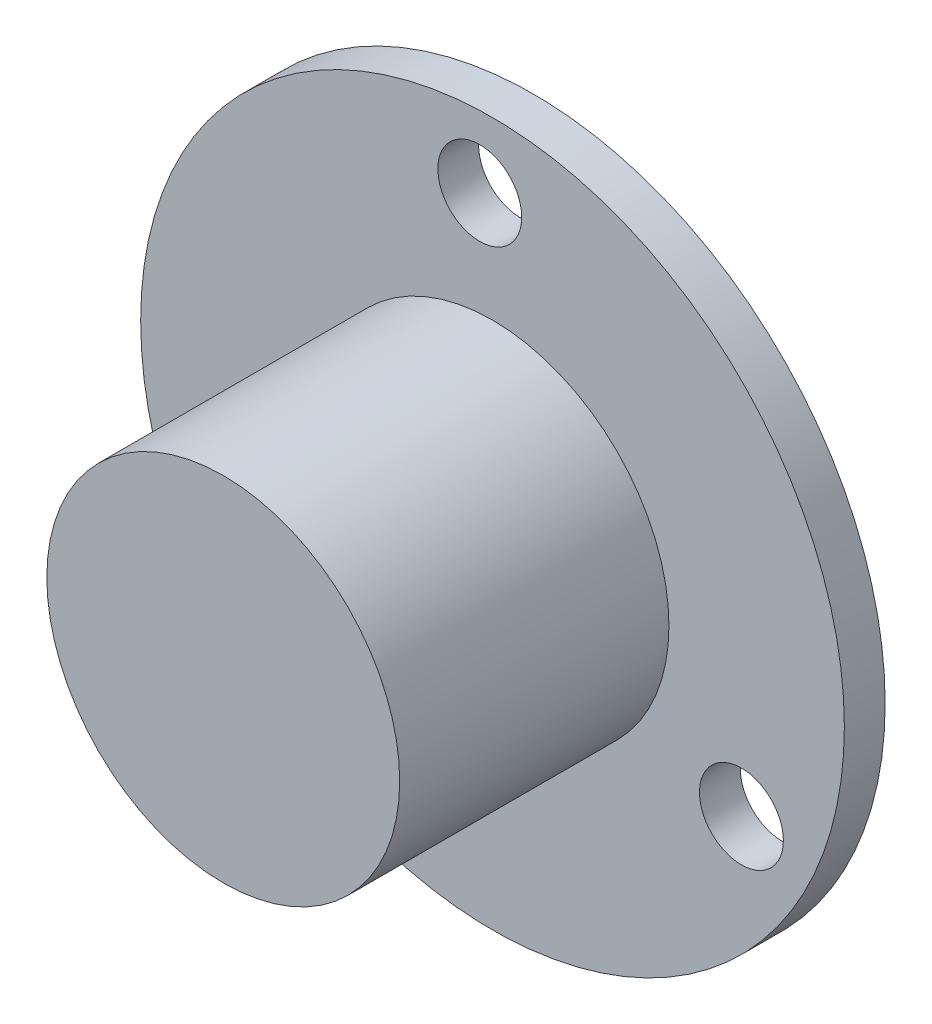
ISO-10303-21;
HEADER;
FILE_DESCRIPTION(('STEP AP214'),'2;1');
FILE_NAME('part.step','',(''),(''),'','','');
FILE_SCHEMA(('AUTOMOTIVE_DESIGN { 1 0 10303 214 1 1 1 1 }'));
ENDSEC;
DATA;
#1=APPLICATION_CONTEXT('core data for automotive mechanical design processes');
#2=APPLICATION_PROTOCOL_DEFINITION('international standard','automotive_design',2000,#1);
#3=PRODUCT_CONTEXT('',#1,'mechanical');
#4=PRODUCT('Part','Part','',(#3));
#5=PRODUCT_RELATED_PRODUCT_CATEGORY('part','',(#4));
#6=PRODUCT_DEFINITION_FORMATION('','',#4);
#7=PRODUCT_DEFINITION_CONTEXT('part definition',#1,'design');
#8=PRODUCT_DEFINITION('design','',#6,#7);
#9=PRODUCT_DEFINITION_SHAPE('','',#8);
#10=(LENGTH_UNIT() NAMED_UNIT(*) SI_UNIT(.MILLI.,.METRE.));
#11=(NAMED_UNIT(*) PLANE_ANGLE_UNIT() SI_UNIT($,.RADIAN.));
#12=(NAMED_UNIT(*) SI_UNIT($,.STERADIAN.) SOLID_ANGLE_UNIT());
#13=UNCERTAINTY_MEASURE_WITH_UNIT(LENGTH_MEASURE(1.E-05),#10,'distance_accuracy_value','');
#14=(GEOMETRIC_REPRESENTATION_CONTEXT(3) GLOBAL_UNCERTAINTY_ASSIGNED_CONTEXT((#13)) GLOBAL_UNIT_ASSIGNED_CONTEXT((#10,
#11,#12)) REPRESENTATION_CONTEXT('',''));
#15=CARTESIAN_POINT('',(0.,0.,0.));
#16=DIRECTION('',(0.,0.,1.));
#17=DIRECTION('',(1.,0.,0.));
#18=AXIS2_PLACEMENT_3D('',#15,#16,#17);
#19=CARTESIAN_POINT('',(0.,0.,2.54));
#20=DIRECTION('',(0.,0.,1.));
#21=DIRECTION('',(1.,0.,0.));
#22=AXIS2_PLACEMENT_3D('',#19,#20,#21);
#23=PLANE('',#22);
#24=CARTESIAN_POINT('',(-14.704072056255,-9.4060001204126,2.54));
#25=DIRECTION('',(0.,0.,1.));
#26=DIRECTION('',(1.,0.,0.));
#27=AXIS2_PLACEMENT_3D('',#24,#25,#26);
#28=CIRCLE('',#27,2.61066084405858);
#29=CARTESIAN_POINT('',(-12.0934112121964,-9.4060001204126,2.54));
#30=VERTEX_POINT('',#29);
#31=EDGE_CURVE('E60',#30,#30,#28,.T.);
#32=ORIENTED_EDGE('',*,*,#31,.F.);
#33=EDGE_LOOP('',(#32));
#34=FACE_BOUND('',#33,.T.);
#35=CARTESIAN_POINT('',(-0.793799024149222,17.4371,2.54));
#36=DIRECTION('',(0.,0.,1.));
#37=DIRECTION('',(1.,0.,0.));
#38=AXIS2_PLACEMENT_3D('',#35,#36,#37);
#39=CIRCLE('',#38,2.61066084405858);
#40=CARTESIAN_POINT('',(1.81686181990936,17.4371,2.54));
#41=VERTEX_POINT('',#40);
#42=EDGE_CURVE('E49',#41,#41,#39,.T.);
#43=ORIENTED_EDGE('',*,*,#42,.F.);
#44=EDGE_LOOP('',(#43));
#45=FACE_BOUND('',#44,.T.);
#46=CARTESIAN_POINT('',(0.,0.,2.54));
#47=DIRECTION('',(0.,0.,1.));
#48=DIRECTION('',(1.,0.,0.));
#49=AXIS2_PLACEMENT_3D('',#46,#47,#48);
#50=CIRCLE('',#49,21.9075);
#51=CARTESIAN_POINT('',(21.9075,0.,2.54));
#52=VERTEX_POINT('',#51);
#53=EDGE_CURVE('E40',#52,#52,#50,.T.);
#54=ORIENTED_EDGE('',*,*,#53,.T.);
#55=EDGE_LOOP('',(#54));
#56=FACE_BOUND('',#55,.T.);
#57=CARTESIAN_POINT('',(15.4978710804043,-8.03109987958733,2.54));
#58=DIRECTION('',(0.,0.,1.));
#59=DIRECTION('',(1.,0.,0.));
#60=AXIS2_PLACEMENT_3D('',#57,#58,#59);
#61=CIRCLE('',#60,2.61066084405858);
#62=CARTESIAN_POINT('',(18.1085319244629,-8.03109987958733,2.54));
#63=VERTEX_POINT('',#62);
#64=EDGE_CURVE('E54',#63,#63,#61,.T.);
#65=ORIENTED_EDGE('',*,*,#64,.F.);
#66=EDGE_LOOP('',(#65));
#67=FACE_BOUND('',#66,.T.);
#68=CARTESIAN_POINT('',(0.,0.,2.54));
#69=DIRECTION('',(0.,0.,1.));
#70=DIRECTION('',(1.,0.,0.));
#71=AXIS2_PLACEMENT_3D('',#68,#69,#70);
#72=CIRCLE('',#71,10.9855);
#73=CARTESIAN_POINT('',(10.9855,0.,2.54));
#74=VERTEX_POINT('',#73);
#75=EDGE_CURVE('E72',#74,#74,#72,.T.);
#76=ORIENTED_EDGE('',*,*,#75,.F.);
#77=EDGE_LOOP('',(#76));
#78=FACE_BOUND('',#77,.T.);
#79=ADVANCED_FACE('F33',(#34,#45,#56,#67,#78),#23,.T.);
#80=CARTESIAN_POINT('',(0.,0.,0.));
#81=DIRECTION('',(0.,0.,1.));
#82=DIRECTION('',(1.,0.,0.));
#83=AXIS2_PLACEMENT_3D('',#80,#81,#82);
#84=PLANE('',#83);
#85=CARTESIAN_POINT('',(-14.704072056255,-9.4060001204126,0.));
#86=DIRECTION('',(0.,0.,1.));
#87=DIRECTION('',(1.,0.,0.));
#88=AXIS2_PLACEMENT_3D('',#85,#86,#87);
#89=CIRCLE('',#88,2.61066084405858);
#90=CARTESIAN_POINT('',(-12.0934112121964,-9.4060001204126,0.));
#91=VERTEX_POINT('',#90);
#92=EDGE_CURVE('E63',#91,#91,#89,.T.);
#93=ORIENTED_EDGE('',*,*,#92,.T.);
#94=EDGE_LOOP('',(#93));
#95=FACE_BOUND('',#94,.T.);
#96=CARTESIAN_POINT('',(-0.793799024149222,17.4371,0.));
#97=DIRECTION('',(0.,0.,1.));
#98=DIRECTION('',(1.,0.,0.));
#99=AXIS2_PLACEMENT_3D('',#96,#97,#98);
#100=CIRCLE('',#99,2.61066084405858);
#101=CARTESIAN_POINT('',(1.81686181990936,17.4371,0.));
#102=VERTEX_POINT('',#101);
#103=EDGE_CURVE('E51',#102,#102,#100,.T.);
#104=ORIENTED_EDGE('',*,*,#103,.T.);
#105=EDGE_LOOP('',(#104));
#106=FACE_BOUND('',#105,.T.);
#107=CARTESIAN_POINT('',(0.,0.,0.));
#108=DIRECTION('',(0.,0.,1.));
#109=DIRECTION('',(1.,0.,0.));
#110=AXIS2_PLACEMENT_3D('',#107,#108,#109);
#111=CIRCLE('',#110,21.9075);
#112=CARTESIAN_POINT('',(21.9075,0.,0.));
#113=VERTEX_POINT('',#112);
#114=EDGE_CURVE('E44',#113,#113,#111,.T.);
#115=ORIENTED_EDGE('',*,*,#114,.F.);
#116=EDGE_LOOP('',(#115));
#117=FACE_BOUND('',#116,.T.);
#118=CARTESIAN_POINT('',(15.4978710804043,-8.03109987958733,0.));
#119=DIRECTION('',(0.,0.,1.));
#120=DIRECTION('',(1.,0.,0.));
#121=AXIS2_PLACEMENT_3D('',#118,#119,#120);
#122=CIRCLE('',#121,2.61066084405858);
#123=CARTESIAN_POINT('',(18.1085319244629,-8.03109987958733,0.));
#124=VERTEX_POINT('',#123);
#125=EDGE_CURVE('E57',#124,#124,#122,.T.);
#126=ORIENTED_EDGE('',*,*,#125,.T.);
#127=EDGE_LOOP('',(#126));
#128=FACE_BOUND('',#127,.T.);
#129=CARTESIAN_POINT('',(0.,0.,0.));
#130=DIRECTION('',(0.,0.,1.));
#131=DIRECTION('',(1.,0.,0.));
#132=AXIS2_PLACEMENT_3D('',#129,#130,#131);
#133=CIRCLE('',#132,3.8735);
#134=CARTESIAN_POINT('',(3.8735,0.,0.));
#135=VERTEX_POINT('',#134);
#136=EDGE_CURVE('E10',#135,#135,#133,.F.);
#137=ORIENTED_EDGE('',*,*,#136,.F.);
#138=EDGE_LOOP('',(#137));
#139=FACE_BOUND('',#138,.T.);
#140=ADVANCED_FACE('F88',(#95,#106,#117,#128,#139),#84,.F.);
#141=CARTESIAN_POINT('',(0.,0.,2.54));
#142=DIRECTION('',(0.,0.,-1.));
#143=DIRECTION('',(-1.,0.,0.));
#144=AXIS2_PLACEMENT_3D('',#141,#142,#143);
#145=CYLINDRICAL_SURFACE('',#144,21.9075);
#146=ORIENTED_EDGE('',*,*,#53,.F.);
#147=EDGE_LOOP('',(#146));
#148=FACE_BOUND('',#147,.T.);
#149=ORIENTED_EDGE('',*,*,#114,.T.);
#150=EDGE_LOOP('',(#149));
#151=FACE_BOUND('',#150,.T.);
#152=ADVANCED_FACE('F35',(#148,#151),#145,.T.);
#153=CARTESIAN_POINT('',(-0.793799024149222,17.4371,2.54));
#154=DIRECTION('',(0.,0.,-1.));
#155=DIRECTION('',(-1.,0.,0.));
#156=AXIS2_PLACEMENT_3D('',#153,#154,#155);
#157=CYLINDRICAL_SURFACE('',#156,2.61066084405858);
#158=ORIENTED_EDGE('',*,*,#42,.T.);
#159=EDGE_LOOP('',(#158));
#160=FACE_BOUND('',#159,.T.);
#161=ORIENTED_EDGE('',*,*,#103,.F.);
#162=EDGE_LOOP('',(#161));
#163=FACE_BOUND('',#162,.T.);
#164=ADVANCED_FACE('F98',(#160,#163),#157,.F.);
#165=CARTESIAN_POINT('',(15.4978710804043,-8.03109987958733,2.54));
#166=DIRECTION('',(0.,0.,-1.));
#167=DIRECTION('',(-1.,0.,0.));
#168=AXIS2_PLACEMENT_3D('',#165,#166,#167);
#169=CYLINDRICAL_SURFACE('',#168,2.61066084405858);
#170=ORIENTED_EDGE('',*,*,#64,.T.);
#171=EDGE_LOOP('',(#170));
#172=FACE_BOUND('',#171,.T.);
#173=ORIENTED_EDGE('',*,*,#125,.F.);
#174=EDGE_LOOP('',(#173));
#175=FACE_BOUND('',#174,.T.);
#176=ADVANCED_FACE('F101',(#172,#175),#169,.F.);
#177=CARTESIAN_POINT('',(-14.704072056255,-9.4060001204126,2.54));
#178=DIRECTION('',(0.,0.,-1.));
#179=DIRECTION('',(-1.,0.,0.));
#180=AXIS2_PLACEMENT_3D('',#177,#178,#179);
#181=CYLINDRICAL_SURFACE('',#180,2.61066084405858);
#182=ORIENTED_EDGE('',*,*,#31,.T.);
#183=EDGE_LOOP('',(#182));
#184=FACE_BOUND('',#183,.T.);
#185=ORIENTED_EDGE('',*,*,#92,.F.);
#186=EDGE_LOOP('',(#185));
#187=FACE_BOUND('',#186,.T.);
#188=ADVANCED_FACE('F105',(#184,#187),#181,.F.);
#189=CARTESIAN_POINT('',(0.,0.,-8.89));
#190=DIRECTION('',(0.,0.,1.));
#191=DIRECTION('',(1.,0.,0.));
#192=AXIS2_PLACEMENT_3D('',#189,#190,#191);
#193=CYLINDRICAL_SURFACE('',#192,3.8735);
#194=CARTESIAN_POINT('',(0.,0.,-8.89));
#195=DIRECTION('',(0.,0.,-1.));
#196=DIRECTION('',(-1.,0.,0.));
#197=AXIS2_PLACEMENT_3D('',#194,#195,#196);
#198=CIRCLE('',#197,3.8735);
#199=CARTESIAN_POINT('',(-3.8735,0.,-8.89));
#200=VERTEX_POINT('',#199);
#201=EDGE_CURVE('E66',#200,#200,#198,.T.);
#202=ORIENTED_EDGE('',*,*,#201,.F.);
#203=EDGE_LOOP('',(#202));
#204=FACE_BOUND('',#203,.T.);
#205=ORIENTED_EDGE('',*,*,#136,.T.);
#206=EDGE_LOOP('',(#205));
#207=FACE_BOUND('',#206,.T.);
#208=ADVANCED_FACE('F109',(#204,#207),#193,.T.);
#209=CARTESIAN_POINT('',(0.,0.,-8.89));
#210=DIRECTION('',(0.,0.,-1.));
#211=DIRECTION('',(-1.,0.,0.));
#212=AXIS2_PLACEMENT_3D('',#209,#210,#211);
#213=PLANE('',#212);
#214=ORIENTED_EDGE('',*,*,#201,.T.);
#215=EDGE_LOOP('',(#214));
#216=FACE_BOUND('',#215,.T.);
#217=ADVANCED_FACE('F83',(#216),#213,.T.);
#218=CARTESIAN_POINT('',(0.,0.,19.304));
#219=DIRECTION('',(0.,0.,-1.));
#220=DIRECTION('',(-1.,0.,0.));
#221=AXIS2_PLACEMENT_3D('',#218,#219,#220);
#222=CYLINDRICAL_SURFACE('',#221,10.9855);
#223=CARTESIAN_POINT('',(0.,0.,19.304));
#224=DIRECTION('',(0.,0.,1.));
#225=DIRECTION('',(1.,0.,0.));
#226=AXIS2_PLACEMENT_3D('',#223,#224,#225);
#227=CIRCLE('',#226,10.9855);
#228=CARTESIAN_POINT('',(10.9855,0.,19.304));
#229=VERTEX_POINT('',#228);
#230=EDGE_CURVE('E71',#229,#229,#227,.T.);
#231=ORIENTED_EDGE('',*,*,#230,.F.);
#232=EDGE_LOOP('',(#231));
#233=FACE_BOUND('',#232,.T.);
#234=ORIENTED_EDGE('',*,*,#75,.T.);
#235=EDGE_LOOP('',(#234));
#236=FACE_BOUND('',#235,.T.);
#237=ADVANCED_FACE('F80',(#233,#236),#222,.T.);
#238=CARTESIAN_POINT('',(0.,0.,19.304));
#239=DIRECTION('',(0.,0.,1.));
#240=DIRECTION('',(1.,0.,0.));
#241=AXIS2_PLACEMENT_3D('',#238,#239,#240);
#242=PLANE('',#241);
#243=ORIENTED_EDGE('',*,*,#230,.T.);
#244=EDGE_LOOP('',(#243));
#245=FACE_BOUND('',#244,.T.);
#246=ADVANCED_FACE('F78',(#245),#242,.T.);
#247=CLOSED_SHELL('',(#79,#140,#152,#164,#176,#188,#208,#217,#237,#246));
#248=MANIFOLD_SOLID_BREP('B2',#247);
#249=ADVANCED_BREP_SHAPE_REPRESENTATION('',(#18,#248),#14);
#250=SHAPE_DEFINITION_REPRESENTATION(#9,#249);
ENDSEC;
END-ISO-10303-21;
